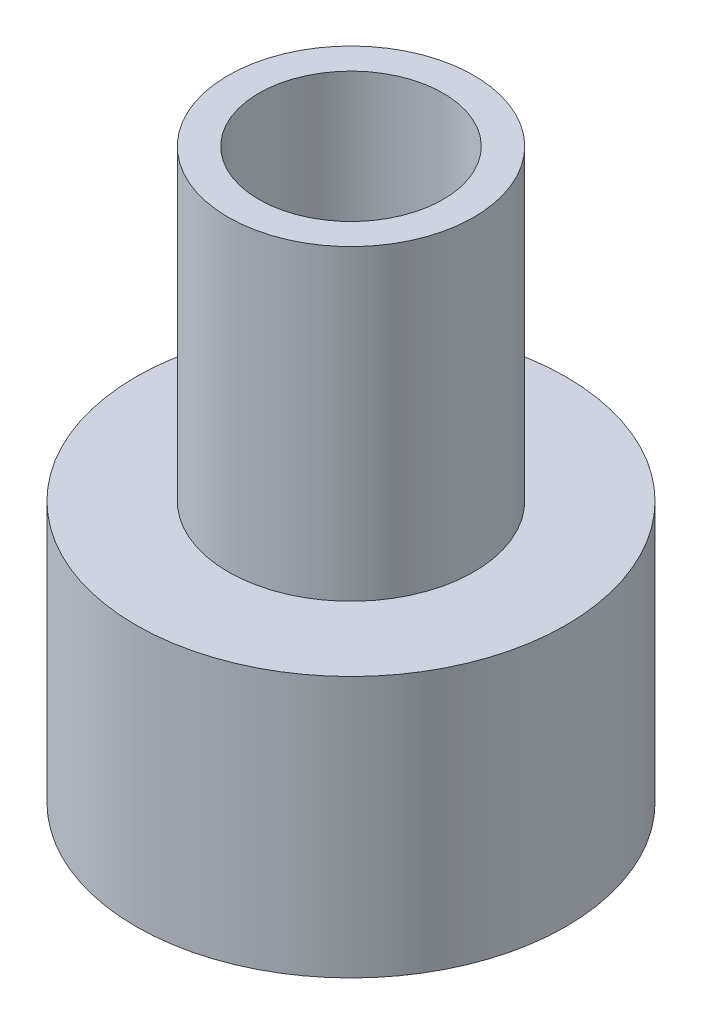
ISO-10303-21;
HEADER;
FILE_DESCRIPTION(('STEP AP214'),'2;1');
FILE_NAME('part.step','',(''),(''),'','','');
FILE_SCHEMA(('AUTOMOTIVE_DESIGN { 1 0 10303 214 1 1 1 1 }'));
ENDSEC;
DATA;
#1=APPLICATION_CONTEXT('core data for automotive mechanical design processes');
#2=APPLICATION_PROTOCOL_DEFINITION('international standard','automotive_design',2000,#1);
#3=PRODUCT_CONTEXT('',#1,'mechanical');
#4=PRODUCT('Part','Part','',(#3));
#5=PRODUCT_RELATED_PRODUCT_CATEGORY('part','',(#4));
#6=PRODUCT_DEFINITION_FORMATION('','',#4);
#7=PRODUCT_DEFINITION_CONTEXT('part definition',#1,'design');
#8=PRODUCT_DEFINITION('design','',#6,#7);
#9=PRODUCT_DEFINITION_SHAPE('','',#8);
#10=(LENGTH_UNIT() NAMED_UNIT(*) SI_UNIT(.MILLI.,.METRE.));
#11=(NAMED_UNIT(*) PLANE_ANGLE_UNIT() SI_UNIT($,.RADIAN.));
#12=(NAMED_UNIT(*) SI_UNIT($,.STERADIAN.) SOLID_ANGLE_UNIT());
#13=UNCERTAINTY_MEASURE_WITH_UNIT(LENGTH_MEASURE(1.E-05),#10,'distance_accuracy_value','');
#14=(GEOMETRIC_REPRESENTATION_CONTEXT(3) GLOBAL_UNCERTAINTY_ASSIGNED_CONTEXT((#13)) GLOBAL_UNIT_ASSIGNED_CONTEXT((#10,
#11,#12)) REPRESENTATION_CONTEXT('',''));
#15=CARTESIAN_POINT('',(0.,0.,0.));
#16=DIRECTION('',(0.,0.,1.));
#17=DIRECTION('',(1.,0.,0.));
#18=AXIS2_PLACEMENT_3D('',#15,#16,#17);
#19=CARTESIAN_POINT('',(0.,10.,0.));
#20=DIRECTION('',(0.,1.,0.));
#21=DIRECTION('',(0.,0.,1.));
#22=AXIS2_PLACEMENT_3D('',#19,#20,#21);
#23=PLANE('',#22);
#24=CARTESIAN_POINT('',(0.,10.,0.));
#25=DIRECTION('',(0.,1.,0.));
#26=DIRECTION('',(0.,0.,1.));
#27=AXIS2_PLACEMENT_3D('',#24,#25,#26);
#28=CIRCLE('',#27,4.);
#29=CARTESIAN_POINT('',(0.,10.,4.));
#30=VERTEX_POINT('',#29);
#31=EDGE_CURVE('E11',#30,#30,#28,.T.);
#32=ORIENTED_EDGE('',*,*,#31,.T.);
#33=EDGE_LOOP('',(#32));
#34=FACE_BOUND('',#33,.T.);
#35=CARTESIAN_POINT('',(0.,10.,0.));
#36=DIRECTION('',(0.,1.,0.));
#37=DIRECTION('',(0.,0.,1.));
#38=AXIS2_PLACEMENT_3D('',#35,#36,#37);
#39=CIRCLE('',#38,3.);
#40=CARTESIAN_POINT('',(0.,10.,3.));
#41=VERTEX_POINT('',#40);
#42=EDGE_CURVE('E41',#41,#41,#39,.T.);
#43=ORIENTED_EDGE('',*,*,#42,.F.);
#44=EDGE_LOOP('',(#43));
#45=FACE_BOUND('',#44,.T.);
#46=ADVANCED_FACE('F33',(#34,#45),#23,.T.);
#47=CARTESIAN_POINT('',(0.,10.,0.));
#48=DIRECTION('',(0.,-1.,0.));
#49=DIRECTION('',(0.,0.,-1.));
#50=AXIS2_PLACEMENT_3D('',#47,#48,#49);
#51=CYLINDRICAL_SURFACE('',#50,4.);
#52=ORIENTED_EDGE('',*,*,#31,.F.);
#53=EDGE_LOOP('',(#52));
#54=FACE_BOUND('',#53,.T.);
#55=CARTESIAN_POINT('',(0.,0.,0.));
#56=DIRECTION('',(0.,1.,0.));
#57=DIRECTION('',(0.,0.,1.));
#58=AXIS2_PLACEMENT_3D('',#55,#56,#57);
#59=CIRCLE('',#58,4.);
#60=CARTESIAN_POINT('',(0.,0.,4.));
#61=VERTEX_POINT('',#60);
#62=EDGE_CURVE('E37',#61,#61,#59,.T.);
#63=ORIENTED_EDGE('',*,*,#62,.T.);
#64=EDGE_LOOP('',(#63));
#65=FACE_BOUND('',#64,.T.);
#66=ADVANCED_FACE('F35',(#54,#65),#51,.T.);
#67=CARTESIAN_POINT('',(0.,10.,0.));
#68=DIRECTION('',(0.,-1.,0.));
#69=DIRECTION('',(0.,0.,-1.));
#70=AXIS2_PLACEMENT_3D('',#67,#68,#69);
#71=CYLINDRICAL_SURFACE('',#70,3.);
#72=ORIENTED_EDGE('',*,*,#42,.T.);
#73=EDGE_LOOP('',(#72));
#74=FACE_BOUND('',#73,.T.);
#75=CARTESIAN_POINT('',(0.,0.,0.));
#76=DIRECTION('',(0.,1.,0.));
#77=DIRECTION('',(0.,0.,1.));
#78=AXIS2_PLACEMENT_3D('',#75,#76,#77);
#79=CIRCLE('',#78,3.);
#80=CARTESIAN_POINT('',(0.,0.,3.));
#81=VERTEX_POINT('',#80);
#82=EDGE_CURVE('E45',#81,#81,#79,.T.);
#83=ORIENTED_EDGE('',*,*,#82,.F.);
#84=EDGE_LOOP('',(#83));
#85=FACE_BOUND('',#84,.T.);
#86=ADVANCED_FACE('F91',(#74,#85),#71,.F.);
#87=CARTESIAN_POINT('',(0.,0.,0.));
#88=DIRECTION('',(0.,1.,0.));
#89=DIRECTION('',(0.,0.,1.));
#90=AXIS2_PLACEMENT_3D('',#87,#88,#89);
#91=PLANE('',#90);
#92=ORIENTED_EDGE('',*,*,#82,.T.);
#93=EDGE_LOOP('',(#92));
#94=FACE_BOUND('',#93,.T.);
#95=ADVANCED_FACE('F76',(#94),#91,.T.);
#96=CARTESIAN_POINT('',(0.,-8.5,0.));
#97=DIRECTION('',(0.,1.,0.));
#98=DIRECTION('',(0.,0.,1.));
#99=AXIS2_PLACEMENT_3D('',#96,#97,#98);
#100=CYLINDRICAL_SURFACE('',#99,7.);
#101=CARTESIAN_POINT('',(0.,-8.5,0.));
#102=DIRECTION('',(0.,1.,0.));
#103=DIRECTION('',(0.,0.,1.));
#104=AXIS2_PLACEMENT_3D('',#101,#102,#103);
#105=CIRCLE('',#104,7.);
#106=CARTESIAN_POINT('',(0.,-8.5,7.));
#107=VERTEX_POINT('',#106);
#108=EDGE_CURVE('E53',#107,#107,#105,.T.);
#109=ORIENTED_EDGE('',*,*,#108,.T.);
#110=EDGE_LOOP('',(#109));
#111=FACE_BOUND('',#110,.T.);
#112=CARTESIAN_POINT('',(0.,0.,0.));
#113=DIRECTION('',(0.,1.,0.));
#114=DIRECTION('',(0.,0.,1.));
#115=AXIS2_PLACEMENT_3D('',#112,#113,#114);
#116=CIRCLE('',#115,7.);
#117=CARTESIAN_POINT('',(0.,0.,7.));
#118=VERTEX_POINT('',#117);
#119=EDGE_CURVE('E50',#118,#118,#116,.T.);
#120=ORIENTED_EDGE('',*,*,#119,.F.);
#121=EDGE_LOOP('',(#120));
#122=FACE_BOUND('',#121,.T.);
#123=ADVANCED_FACE('F70',(#111,#122),#100,.T.);
#124=CARTESIAN_POINT('',(0.,-8.5,0.));
#125=DIRECTION('',(0.,1.,0.));
#126=DIRECTION('',(0.,0.,1.));
#127=AXIS2_PLACEMENT_3D('',#124,#125,#126);
#128=PLANE('',#127);
#129=CARTESIAN_POINT('',(0.,-8.5,0.));
#130=DIRECTION('',(0.,-1.,0.));
#131=DIRECTION('',(0.,0.,-1.));
#132=AXIS2_PLACEMENT_3D('',#129,#130,#131);
#133=CIRCLE('',#132,6.);
#134=CARTESIAN_POINT('',(0.,-8.5,-6.));
#135=VERTEX_POINT('',#134);
#136=EDGE_CURVE('E59',#135,#135,#133,.T.);
#137=ORIENTED_EDGE('',*,*,#136,.F.);
#138=EDGE_LOOP('',(#137));
#139=FACE_BOUND('',#138,.T.);
#140=ORIENTED_EDGE('',*,*,#108,.F.);
#141=EDGE_LOOP('',(#140));
#142=FACE_BOUND('',#141,.T.);
#143=ADVANCED_FACE('F66',(#139,#142),#128,.F.);
#144=ORIENTED_EDGE('',*,*,#62,.F.);
#145=EDGE_LOOP('',(#144));
#146=FACE_BOUND('',#145,.T.);
#147=ORIENTED_EDGE('',*,*,#119,.T.);
#148=EDGE_LOOP('',(#147));
#149=FACE_BOUND('',#148,.T.);
#150=ADVANCED_FACE('F69',(#146,#149),#91,.T.);
#151=CARTESIAN_POINT('',(0.,-2.,0.));
#152=DIRECTION('',(0.,1.,0.));
#153=DIRECTION('',(0.,0.,1.));
#154=AXIS2_PLACEMENT_3D('',#151,#152,#153);
#155=PLANE('',#154);
#156=CARTESIAN_POINT('',(0.,-2.,0.));
#157=DIRECTION('',(0.,1.,0.));
#158=DIRECTION('',(0.,0.,1.));
#159=AXIS2_PLACEMENT_3D('',#156,#157,#158);
#160=CIRCLE('',#159,6.);
#161=CARTESIAN_POINT('',(0.,-2.00000000000001,-6.));
#162=VERTEX_POINT('',#161);
#163=EDGE_CURVE('E54',#162,#162,#160,.F.);
#164=ORIENTED_EDGE('',*,*,#163,.T.);
#165=EDGE_LOOP('',(#164));
#166=FACE_BOUND('',#165,.T.);
#167=ADVANCED_FACE('F81',(#166),#155,.F.);
#168=CARTESIAN_POINT('',(0.,16.9705627484771,0.));
#169=DIRECTION('',(0.,-1.,0.));
#170=DIRECTION('',(0.,0.,-1.));
#171=AXIS2_PLACEMENT_3D('',#168,#169,#170);
#172=CYLINDRICAL_SURFACE('',#171,6.);
#173=CARTESIAN_POINT('',(0.,-8.5,-6.));
#174=CARTESIAN_POINT('',(0.,-8.43229166666666,-6.));
#175=CARTESIAN_POINT('',(0.,-8.36458333333333,-6.));
#176=CARTESIAN_POINT('',(0.,-8.22916666666666,-6.));
#177=CARTESIAN_POINT('',(0.,-8.16145833333333,-6.));
#178=CARTESIAN_POINT('',(0.,-8.02604166666666,-6.));
#179=CARTESIAN_POINT('',(0.,-7.95833333333333,-6.));
#180=CARTESIAN_POINT('',(0.,-7.82291666666666,-6.));
#181=CARTESIAN_POINT('',(0.,-7.75520833333333,-6.));
#182=CARTESIAN_POINT('',(0.,-7.61979166666666,-6.));
#183=CARTESIAN_POINT('',(0.,-7.55208333333333,-6.));
#184=CARTESIAN_POINT('',(0.,-7.41666666666667,-6.));
#185=CARTESIAN_POINT('',(0.,-7.34895833333333,-6.));
#186=CARTESIAN_POINT('',(0.,-7.21354166666667,-6.));
#187=CARTESIAN_POINT('',(0.,-7.14583333333333,-6.));
#188=CARTESIAN_POINT('',(0.,-7.01041666666667,-6.));
#189=CARTESIAN_POINT('',(0.,-6.94270833333333,-6.));
#190=CARTESIAN_POINT('',(0.,-6.80729166666667,-6.));
#191=CARTESIAN_POINT('',(0.,-6.73958333333333,-6.));
#192=CARTESIAN_POINT('',(0.,-6.60416666666667,-6.));
#193=CARTESIAN_POINT('',(0.,-6.53645833333333,-6.));
#194=CARTESIAN_POINT('',(0.,-6.40104166666667,-6.));
#195=CARTESIAN_POINT('',(0.,-6.33333333333333,-6.));
#196=CARTESIAN_POINT('',(0.,-6.19791666666667,-6.));
#197=CARTESIAN_POINT('',(0.,-6.13020833333333,-6.));
#198=CARTESIAN_POINT('',(0.,-5.99479166666667,-6.));
#199=CARTESIAN_POINT('',(0.,-5.92708333333333,-6.));
#200=CARTESIAN_POINT('',(0.,-5.79166666666667,-6.));
#201=CARTESIAN_POINT('',(0.,-5.72395833333333,-6.));
#202=CARTESIAN_POINT('',(0.,-5.58854166666667,-6.));
#203=CARTESIAN_POINT('',(0.,-5.52083333333333,-6.));
#204=CARTESIAN_POINT('',(0.,-5.38541666666667,-6.));
#205=CARTESIAN_POINT('',(0.,-5.31770833333333,-6.));
#206=CARTESIAN_POINT('',(0.,-5.18229166666667,-6.));
#207=CARTESIAN_POINT('',(0.,-5.11458333333334,-6.));
#208=CARTESIAN_POINT('',(0.,-4.97916666666667,-6.));
#209=CARTESIAN_POINT('',(0.,-4.91145833333333,-6.));
#210=CARTESIAN_POINT('',(0.,-4.77604166666667,-6.));
#211=CARTESIAN_POINT('',(0.,-4.70833333333333,-6.));
#212=CARTESIAN_POINT('',(0.,-4.57291666666667,-6.));
#213=CARTESIAN_POINT('',(0.,-4.50520833333333,-6.));
#214=CARTESIAN_POINT('',(0.,-4.36979166666667,-6.));
#215=CARTESIAN_POINT('',(0.,-4.30208333333333,-6.));
#216=CARTESIAN_POINT('',(0.,-4.16666666666667,-6.));
#217=CARTESIAN_POINT('',(0.,-4.09895833333334,-6.));
#218=CARTESIAN_POINT('',(0.,-3.96354166666667,-6.));
#219=CARTESIAN_POINT('',(0.,-3.89583333333334,-6.));
#220=CARTESIAN_POINT('',(0.,-3.76041666666667,-6.));
#221=CARTESIAN_POINT('',(0.,-3.69270833333334,-6.));
#222=CARTESIAN_POINT('',(0.,-3.55729166666667,-6.));
#223=CARTESIAN_POINT('',(0.,-3.48958333333334,-6.));
#224=CARTESIAN_POINT('',(0.,-3.35416666666667,-6.));
#225=CARTESIAN_POINT('',(0.,-3.28645833333334,-6.));
#226=CARTESIAN_POINT('',(0.,-3.15104166666667,-6.));
#227=CARTESIAN_POINT('',(0.,-3.08333333333334,-6.));
#228=CARTESIAN_POINT('',(0.,-2.94791666666667,-6.));
#229=CARTESIAN_POINT('',(0.,-2.88020833333334,-6.));
#230=CARTESIAN_POINT('',(0.,-2.74479166666667,-6.));
#231=CARTESIAN_POINT('',(0.,-2.67708333333334,-6.));
#232=CARTESIAN_POINT('',(0.,-2.54166666666667,-6.));
#233=CARTESIAN_POINT('',(0.,-2.47395833333334,-6.));
#234=CARTESIAN_POINT('',(0.,-2.33854166666667,-6.));
#235=CARTESIAN_POINT('',(0.,-2.27083333333334,-6.));
#236=CARTESIAN_POINT('',(0.,-2.13541666666667,-6.));
#237=CARTESIAN_POINT('',(0.,-2.06770833333334,-6.));
#238=CARTESIAN_POINT('',(0.,-2.00000000000001,-6.));
#239=B_SPLINE_CURVE_WITH_KNOTS('',3,(#173,#174,#175,#176,#177,#178,#179,#180,#181,#182,#183,
#184,#185,#186,#187,#188,#189,#190,#191,#192,#193,#194,#195,#196,#197,#198,#199,#200,#201,#202,
#203,#204,#205,#206,#207,#208,#209,#210,#211,#212,#213,#214,#215,#216,#217,#218,#219,#220,#221,
#222,#223,#224,#225,#226,#227,#228,#229,#230,#231,#232,#233,#234,#235,#236,#237,#238),
.UNSPECIFIED.,.F.,.F.,(4,2,2,2,2,2,2,2,2,2,2,2,2,2,2,2,2,2,2,2,2,2,2,2,2,2,2,2,2,2,2,2,4),(0.,
0.203124999999998,0.40625,0.609374999999999,0.812500000000001,1.015625,1.21875,1.421875,1.625,
1.828125,2.03125,2.234375,2.4375,2.640625,2.84375,3.046875,3.25,3.45312499999999,3.65625,
3.85937499999999,4.0625,4.26562499999999,4.46874999999999,4.67187499999999,4.87499999999999,
5.078125,5.28124999999999,5.48437499999999,5.68749999999999,5.89062499999999,6.09374999999999,
6.29687499999999,6.49999999999999),.UNSPECIFIED.);
#240=EDGE_CURVE('BSEAM63',#135,#162,#239,.T.);
#241=ORIENTED_EDGE('',*,*,#136,.T.);
#242=ORIENTED_EDGE('',*,*,#163,.F.);
#243=ORIENTED_EDGE('',*,*,#240,.T.);
#244=ORIENTED_EDGE('',*,*,#240,.F.);
#245=EDGE_LOOP('',(#241,#243,#242,#244));
#246=FACE_BOUND('',#245,.T.);
#247=ADVANCED_FACE('F63',(#246),#172,.F.);
#248=CLOSED_SHELL('',(#46,#66,#86,#95,#123,#143,#150,#167,#247));
#249=MANIFOLD_SOLID_BREP('B2',#248);
#250=ADVANCED_BREP_SHAPE_REPRESENTATION('',(#18,#249),#14);
#251=SHAPE_DEFINITION_REPRESENTATION(#9,#250);
ENDSEC;
END-ISO-10303-21;
